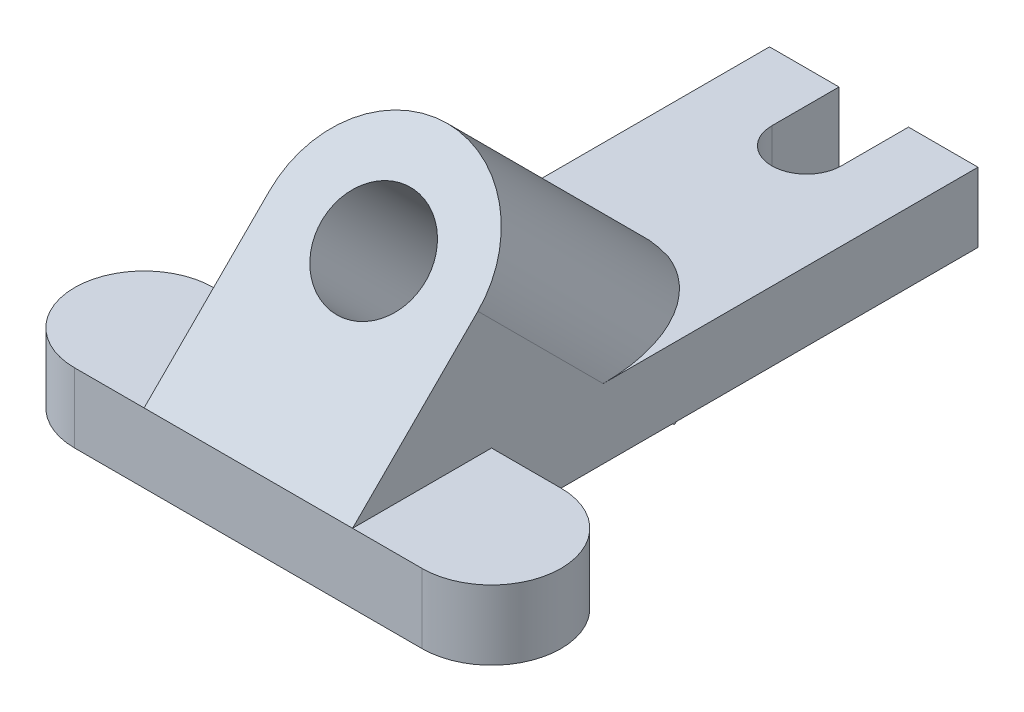
ISO-10303-21;
HEADER;
FILE_DESCRIPTION(('STEP AP214'),'2;1');
FILE_NAME('part.step','',(''),(''),'','','');
FILE_SCHEMA(('AUTOMOTIVE_DESIGN { 1 0 10303 214 1 1 1 1 }'));
ENDSEC;
DATA;
#1=APPLICATION_CONTEXT('core data for automotive mechanical design processes');
#2=APPLICATION_PROTOCOL_DEFINITION('international standard','automotive_design',2000,#1);
#3=PRODUCT_CONTEXT('',#1,'mechanical');
#4=PRODUCT('Part','Part','',(#3));
#5=PRODUCT_RELATED_PRODUCT_CATEGORY('part','',(#4));
#6=PRODUCT_DEFINITION_FORMATION('','',#4);
#7=PRODUCT_DEFINITION_CONTEXT('part definition',#1,'design');
#8=PRODUCT_DEFINITION('design','',#6,#7);
#9=PRODUCT_DEFINITION_SHAPE('','',#8);
#10=(LENGTH_UNIT() NAMED_UNIT(*) SI_UNIT(.MILLI.,.METRE.));
#11=(NAMED_UNIT(*) PLANE_ANGLE_UNIT() SI_UNIT($,.RADIAN.));
#12=(NAMED_UNIT(*) SI_UNIT($,.STERADIAN.) SOLID_ANGLE_UNIT());
#13=UNCERTAINTY_MEASURE_WITH_UNIT(LENGTH_MEASURE(1.E-05),#10,'distance_accuracy_value','');
#14=(GEOMETRIC_REPRESENTATION_CONTEXT(3) GLOBAL_UNCERTAINTY_ASSIGNED_CONTEXT((#13)) GLOBAL_UNIT_ASSIGNED_CONTEXT((#10,
#11,#12)) REPRESENTATION_CONTEXT('',''));
#15=CARTESIAN_POINT('',(0.,0.,0.));
#16=DIRECTION('',(0.,0.,1.));
#17=DIRECTION('',(1.,0.,0.));
#18=AXIS2_PLACEMENT_3D('',#15,#16,#17);
#19=CARTESIAN_POINT('',(-60.,29.4418604651163,-70.3255813953488));
#20=DIRECTION('',(0.,0.,-1.));
#21=DIRECTION('',(-1.,0.,0.));
#22=AXIS2_PLACEMENT_3D('',#19,#20,#21);
#23=PLANE('',#22);
#24=DIRECTION('',(0.,1.,0.));
#25=VECTOR('',#24,1.);
#26=CARTESIAN_POINT('',(-20.,9.44186046511627,-70.3255813953488));
#27=LINE('',#26,#25);
#28=CARTESIAN_POINT('',(-20.,9.44186046511627,-70.3255813953488));
#29=VERTEX_POINT('',#28);
#30=CARTESIAN_POINT('',(-20.,29.4418604651163,-70.3255813953488));
#31=VERTEX_POINT('',#30);
#32=EDGE_CURVE('E220',#29,#31,#27,.T.);
#33=ORIENTED_EDGE('',*,*,#32,.T.);
#34=DIRECTION('',(1.,0.,0.));
#35=VECTOR('',#34,1.);
#36=CARTESIAN_POINT('',(-60.,29.4418604651163,-70.3255813953488));
#37=LINE('',#36,#35);
#38=CARTESIAN_POINT('',(0.,29.4418604651163,-70.3255813953488));
#39=VERTEX_POINT('',#38);
#40=EDGE_CURVE('E355',#31,#39,#37,.T.);
#41=ORIENTED_EDGE('',*,*,#40,.T.);
#42=DIRECTION('',(0.,1.,0.));
#43=VECTOR('',#42,1.);
#44=CARTESIAN_POINT('',(0.,29.4418604651163,-70.3255813953488));
#45=LINE('',#44,#43);
#46=CARTESIAN_POINT('',(0.,9.44186046511627,-70.3255813953488));
#47=VERTEX_POINT('',#46);
#48=EDGE_CURVE('E340',#47,#39,#45,.T.);
#49=ORIENTED_EDGE('',*,*,#48,.F.);
#50=DIRECTION('',(1.,0.,0.));
#51=VECTOR('',#50,1.);
#52=CARTESIAN_POINT('',(-60.,9.44186046511627,-70.3255813953488));
#53=LINE('',#52,#51);
#54=EDGE_CURVE('E337',#29,#47,#53,.T.);
#55=ORIENTED_EDGE('',*,*,#54,.F.);
#56=EDGE_LOOP('',(#33,#41,#49,#55));
#57=FACE_BOUND('',#56,.T.);
#58=ADVANCED_FACE('F41',(#57),#23,.T.);
#59=CARTESIAN_POINT('',(0.,8.93576381070593,17.0434302692135));
#60=DIRECTION('',(0.,0.707106781186544,-0.707106781186551));
#61=DIRECTION('',(0.,0.707106781186551,0.707106781186544));
#62=AXIS2_PLACEMENT_3D('',#59,#60,#61);
#63=PLANE('',#62);
#64=DIRECTION('',(-1.,0.,0.));
#65=VECTOR('',#64,1.);
#66=CARTESIAN_POINT('',(0.,8.93576381070593,17.0434302692135));
#67=LINE('',#66,#65);
#68=CARTESIAN_POINT('',(-45.,8.93576381070593,17.0434302692135));
#69=VERTEX_POINT('',#68);
#70=CARTESIAN_POINT('',(-60.,8.93576381070592,17.0434302692136));
#71=VERTEX_POINT('',#70);
#72=EDGE_CURVE('E288',#69,#71,#67,.T.);
#73=ORIENTED_EDGE('',*,*,#72,.F.);
#74=DIRECTION('',(0.,0.707106781186551,0.707106781186544));
#75=VECTOR('',#74,1.);
#76=CARTESIAN_POINT('',(-45.,8.93576381070593,17.0434302692135));
#77=LINE('',#76,#75);
#78=CARTESIAN_POINT('',(-45.,9.44186046511626,17.5495269236239));
#79=VERTEX_POINT('',#78);
#80=EDGE_CURVE('E280',#69,#79,#77,.T.);
#81=ORIENTED_EDGE('',*,*,#80,.T.);
#82=DIRECTION('',(1.,0.,0.));
#83=VECTOR('',#82,1.);
#84=CARTESIAN_POINT('',(-60.,9.44186046511626,17.5495269236239));
#85=LINE('',#84,#83);
#86=CARTESIAN_POINT('',(-60.,9.44186046511626,17.5495269236239));
#87=VERTEX_POINT('',#86);
#88=EDGE_CURVE('E309',#87,#79,#85,.T.);
#89=ORIENTED_EDGE('',*,*,#88,.F.);
#90=DIRECTION('',(0.,0.707106781186551,0.707106781186544));
#91=VECTOR('',#90,1.);
#92=CARTESIAN_POINT('',(-60.,8.93576381070592,17.0434302692136));
#93=LINE('',#92,#91);
#94=EDGE_CURVE('E296',#71,#87,#93,.T.);
#95=ORIENTED_EDGE('',*,*,#94,.F.);
#96=EDGE_LOOP('',(#73,#81,#89,#95));
#97=FACE_BOUND('',#96,.T.);
#98=ADVANCED_FACE('F374',(#97),#63,.F.);
#99=CARTESIAN_POINT('',(0.,12.9895970399598,12.9895970399597));
#100=DIRECTION('',(0.,0.707106781186551,0.707106781186544));
#101=DIRECTION('',(0.,-0.707106781186544,0.707106781186551));
#102=AXIS2_PLACEMENT_3D('',#99,#100,#101);
#103=PLANE('',#102);
#104=CARTESIAN_POINT('',(0.,8.93576381070593,17.0434302692135));
#105=VERTEX_POINT('',#104);
#106=CARTESIAN_POINT('',(-15.,8.93576381070593,17.0434302692135));
#107=VERTEX_POINT('',#106);
#108=EDGE_CURVE('E284',#105,#107,#67,.T.);
#109=ORIENTED_EDGE('',*,*,#108,.T.);
#110=CARTESIAN_POINT('',(-30.,8.93576381070592,17.0434302692135));
#111=DIRECTION('',(0.,0.707106781186551,0.707106781186544));
#112=DIRECTION('',(0.,-0.707106781186544,0.707106781186551));
#113=AXIS2_PLACEMENT_3D('',#110,#111,#112);
#114=CIRCLE('',#113,15.);
#115=CARTESIAN_POINT('',(-15.0170853185106,9.44186046511625,16.5373336148032));
#116=VERTEX_POINT('',#115);
#117=EDGE_CURVE('E269',#107,#116,#114,.T.);
#118=ORIENTED_EDGE('',*,*,#117,.T.);
#119=DIRECTION('',(-1.,0.,0.));
#120=VECTOR('',#119,1.);
#121=CARTESIAN_POINT('',(-60.,9.44186046511626,16.5373336148032));
#122=LINE('',#121,#120);
#123=CARTESIAN_POINT('',(-0.00853900936485796,9.44186046511627,16.5373336148032));
#124=VERTEX_POINT('',#123);
#125=EDGE_CURVE('E49',#124,#116,#122,.T.);
#126=ORIENTED_EDGE('',*,*,#125,.F.);
#127=CARTESIAN_POINT('',(-30.,8.93576381070593,17.0434302692136));
#128=DIRECTION('',(0.,0.707106781186551,0.707106781186544));
#129=DIRECTION('',(0.,-0.707106781186544,0.707106781186551));
#130=AXIS2_PLACEMENT_3D('',#127,#128,#129);
#131=CIRCLE('',#130,30.);
#132=EDGE_CURVE('E289',#105,#124,#131,.T.);
#133=ORIENTED_EDGE('',*,*,#132,.F.);
#134=EDGE_LOOP('',(#109,#118,#126,#133));
#135=FACE_BOUND('',#134,.T.);
#136=ADVANCED_FACE('F415',(#135),#103,.F.);
#137=CARTESIAN_POINT('',(-60.,9.44186046511627,-70.3255813953488));
#138=DIRECTION('',(0.,-1.,0.));
#139=DIRECTION('',(0.,0.,-1.));
#140=AXIS2_PLACEMENT_3D('',#137,#138,#139);
#141=PLANE('',#140);
#142=CARTESIAN_POINT('',(-30.,9.44186046511626,17.5495269236239));
#143=DIRECTION('',(0.,-1.,0.));
#144=DIRECTION('',(0.,0.,1.));
#145=AXIS2_PLACEMENT_3D('',#142,#143,#144);
#146=ELLIPSE('',#145,21.2132034355963,15.);
#147=CARTESIAN_POINT('',(-15.,9.44186046511627,17.5495269236239));
#148=VERTEX_POINT('',#147);
#149=EDGE_CURVE('E278',#148,#79,#146,.T.);
#150=ORIENTED_EDGE('',*,*,#149,.F.);
#151=CARTESIAN_POINT('',(0.,9.44186046511627,17.5495269236239));
#152=VERTEX_POINT('',#151);
#153=EDGE_CURVE('E313',#148,#152,#85,.T.);
#154=ORIENTED_EDGE('',*,*,#153,.T.);
#155=DIRECTION('',(0.,0.,-1.));
#156=VECTOR('',#155,1.);
#157=CARTESIAN_POINT('',(0.,9.44186046511627,-70.3255813953488));
#158=LINE('',#157,#156);
#159=CARTESIAN_POINT('',(0.,9.44186046511627,69.6744186046512));
#160=VERTEX_POINT('',#159);
#161=EDGE_CURVE('E338',#160,#152,#158,.T.);
#162=ORIENTED_EDGE('',*,*,#161,.F.);
#163=DIRECTION('',(-1.,0.,0.));
#164=VECTOR('',#163,1.);
#165=CARTESIAN_POINT('',(20.,9.44186046511627,69.6744186046512));
#166=LINE('',#165,#164);
#167=CARTESIAN_POINT('',(20.,9.44186046511627,69.6744186046512));
#168=VERTEX_POINT('',#167);
#169=EDGE_CURVE('E253',#168,#160,#166,.T.);
#170=ORIENTED_EDGE('',*,*,#169,.F.);
#171=CARTESIAN_POINT('',(20.,9.44186046511627,89.6744186046511));
#172=DIRECTION('',(0.,1.,0.));
#173=DIRECTION('',(0.,0.,1.));
#174=AXIS2_PLACEMENT_3D('',#171,#172,#173);
#175=CIRCLE('',#174,20.);
#176=CARTESIAN_POINT('',(20.,9.44186046511627,109.674418604651));
#177=VERTEX_POINT('',#176);
#178=EDGE_CURVE('E250',#177,#168,#175,.T.);
#179=ORIENTED_EDGE('',*,*,#178,.F.);
#180=DIRECTION('',(1.,0.,0.));
#181=VECTOR('',#180,1.);
#182=CARTESIAN_POINT('',(-60.,9.44186046511625,109.674418604651));
#183=LINE('',#182,#181);
#184=CARTESIAN_POINT('',(-80.,9.44186046511627,109.674418604651));
#185=VERTEX_POINT('',#184);
#186=EDGE_CURVE('E346',#185,#177,#183,.T.);
#187=ORIENTED_EDGE('',*,*,#186,.F.);
#188=CARTESIAN_POINT('',(-80.,9.44186046511627,89.6744186046511));
#189=DIRECTION('',(0.,1.,0.));
#190=DIRECTION('',(0.,0.,-1.));
#191=AXIS2_PLACEMENT_3D('',#188,#189,#190);
#192=CIRCLE('',#191,20.);
#193=CARTESIAN_POINT('',(-80.,9.44186046511627,69.6744186046511));
#194=VERTEX_POINT('',#193);
#195=EDGE_CURVE('E229',#194,#185,#192,.T.);
#196=ORIENTED_EDGE('',*,*,#195,.F.);
#197=DIRECTION('',(-1.,0.,0.));
#198=VECTOR('',#197,1.);
#199=CARTESIAN_POINT('',(-80.,9.44186046511627,69.6744186046511));
#200=LINE('',#199,#198);
#201=CARTESIAN_POINT('',(-60.,9.44186046511627,69.6744186046512));
#202=VERTEX_POINT('',#201);
#203=EDGE_CURVE('E236',#202,#194,#200,.T.);
#204=ORIENTED_EDGE('',*,*,#203,.F.);
#205=DIRECTION('',(0.,0.,-1.));
#206=VECTOR('',#205,1.);
#207=CARTESIAN_POINT('',(-60.,9.44186046511627,-70.3255813953488));
#208=LINE('',#207,#206);
#209=EDGE_CURVE('E328',#202,#87,#208,.T.);
#210=ORIENTED_EDGE('',*,*,#209,.T.);
#211=ORIENTED_EDGE('',*,*,#88,.T.);
#212=EDGE_LOOP('',(#150,#154,#162,#170,#179,#187,#196,#204,#210,#211));
#213=FACE_BOUND('',#212,.T.);
#214=ADVANCED_FACE('F377',(#213),#141,.T.);
#215=CARTESIAN_POINT('',(-60.,29.4418604651163,109.674418604651));
#216=DIRECTION('',(0.,1.,0.));
#217=DIRECTION('',(0.,0.,1.));
#218=AXIS2_PLACEMENT_3D('',#215,#216,#217);
#219=PLANE('',#218);
#220=DIRECTION('',(0.,0.,-1.));
#221=VECTOR('',#220,1.);
#222=CARTESIAN_POINT('',(-20.,29.4418604651163,-70.3255813953488));
#223=LINE('',#222,#221);
#224=CARTESIAN_POINT('',(-20.,29.4418604651163,-50.9883389137586));
#225=VERTEX_POINT('',#224);
#226=EDGE_CURVE('E212',#225,#31,#223,.T.);
#227=ORIENTED_EDGE('',*,*,#226,.F.);
#228=CARTESIAN_POINT('',(-30.,29.4418604651163,-50.9883389137586));
#229=DIRECTION('',(0.,1.,0.));
#230=DIRECTION('',(0.,0.,1.));
#231=AXIS2_PLACEMENT_3D('',#228,#229,#230);
#232=CIRCLE('',#231,10.);
#233=CARTESIAN_POINT('',(-40.,29.4418604651163,-50.9883389137586));
#234=VERTEX_POINT('',#233);
#235=EDGE_CURVE('E214',#234,#225,#232,.T.);
#236=ORIENTED_EDGE('',*,*,#235,.F.);
#237=DIRECTION('',(0.,0.,1.));
#238=VECTOR('',#237,1.);
#239=CARTESIAN_POINT('',(-40.,29.4418604651163,-70.3255813953488));
#240=LINE('',#239,#238);
#241=CARTESIAN_POINT('',(-40.,29.4418604651163,-70.3255813953488));
#242=VERTEX_POINT('',#241);
#243=EDGE_CURVE('E194',#242,#234,#240,.T.);
#244=ORIENTED_EDGE('',*,*,#243,.F.);
#245=CARTESIAN_POINT('',(-60.,29.4418604651163,-70.3255813953488));
#246=VERTEX_POINT('',#245);
#247=EDGE_CURVE('E352',#246,#242,#37,.T.);
#248=ORIENTED_EDGE('',*,*,#247,.F.);
#249=DIRECTION('',(0.,0.,1.));
#250=VECTOR('',#249,1.);
#251=CARTESIAN_POINT('',(-60.,29.4418604651163,109.674418604651));
#252=LINE('',#251,#250);
#253=CARTESIAN_POINT('',(-60.,29.4418604651163,37.5495269236237));
#254=VERTEX_POINT('',#253);
#255=EDGE_CURVE('E334',#246,#254,#252,.T.);
#256=ORIENTED_EDGE('',*,*,#255,.T.);
#257=CARTESIAN_POINT('',(-30.,29.4418604651163,37.5495269236237));
#258=DIRECTION('',(0.,1.,0.));
#259=DIRECTION('',(0.,0.,1.));
#260=AXIS2_PLACEMENT_3D('',#257,#258,#259);
#261=ELLIPSE('',#260,42.4264068711926,30.);
#262=CARTESIAN_POINT('',(-37.6811457478655,29.4418604651163,-3.46266638519702));
#263=VERTEX_POINT('',#262);
#264=EDGE_CURVE('E305',#263,#254,#261,.T.);
#265=ORIENTED_EDGE('',*,*,#264,.F.);
#266=DIRECTION('',(1.,0.,0.));
#267=VECTOR('',#266,1.);
#268=CARTESIAN_POINT('',(-60.,29.4418604651163,-3.46266638519703));
#269=LINE('',#268,#267);
#270=CARTESIAN_POINT('',(-22.3188542521345,29.4418604651163,-3.46266638519702));
#271=VERTEX_POINT('',#270);
#272=EDGE_CURVE('E312',#263,#271,#269,.T.);
#273=ORIENTED_EDGE('',*,*,#272,.T.);
#274=CARTESIAN_POINT('',(0.,29.4418604651163,37.5495269236237));
#275=VERTEX_POINT('',#274);
#276=EDGE_CURVE('E308',#275,#271,#261,.T.);
#277=ORIENTED_EDGE('',*,*,#276,.F.);
#278=DIRECTION('',(0.,0.,1.));
#279=VECTOR('',#278,1.);
#280=CARTESIAN_POINT('',(0.,29.4418604651163,109.674418604651));
#281=LINE('',#280,#279);
#282=EDGE_CURVE('E343',#39,#275,#281,.T.);
#283=ORIENTED_EDGE('',*,*,#282,.F.);
#284=ORIENTED_EDGE('',*,*,#40,.F.);
#285=EDGE_LOOP('',(#227,#236,#244,#248,#256,#265,#273,#277,#283,#284));
#286=FACE_BOUND('',#285,.T.);
#287=ADVANCED_FACE('F392',(#286),#219,.T.);
#288=DIRECTION('',(0.,0.,-1.));
#289=VECTOR('',#288,1.);
#290=CARTESIAN_POINT('',(-20.,9.44186046511627,-70.3255813953488));
#291=LINE('',#290,#289);
#292=CARTESIAN_POINT('',(-20.,9.44186046511627,-50.9883389137586));
#293=VERTEX_POINT('',#292);
#294=EDGE_CURVE('E207',#293,#29,#291,.T.);
#295=ORIENTED_EDGE('',*,*,#294,.T.);
#296=ORIENTED_EDGE('',*,*,#54,.T.);
#297=EDGE_CURVE('E323',#152,#47,#158,.T.);
#298=ORIENTED_EDGE('',*,*,#297,.F.);
#299=CARTESIAN_POINT('',(-30.,9.44186046511626,17.5495269236239));
#300=DIRECTION('',(0.,-1.,0.));
#301=DIRECTION('',(0.,0.,1.));
#302=AXIS2_PLACEMENT_3D('',#299,#300,#301);
#303=ELLIPSE('',#302,42.4264068711926,30.);
#304=EDGE_CURVE('E299',#124,#152,#303,.T.);
#305=ORIENTED_EDGE('',*,*,#304,.F.);
#306=ORIENTED_EDGE('',*,*,#125,.T.);
#307=CARTESIAN_POINT('',(-44.9829146814894,9.44186046511626,16.5373336148032));
#308=VERTEX_POINT('',#307);
#309=EDGE_CURVE('E357',#116,#308,#122,.T.);
#310=ORIENTED_EDGE('',*,*,#309,.T.);
#311=CARTESIAN_POINT('',(-59.9914609906351,9.44186046511627,16.5373336148032));
#312=VERTEX_POINT('',#311);
#313=EDGE_CURVE('E348',#308,#312,#122,.T.);
#314=ORIENTED_EDGE('',*,*,#313,.T.);
#315=EDGE_CURVE('E304',#87,#312,#303,.T.);
#316=ORIENTED_EDGE('',*,*,#315,.F.);
#317=CARTESIAN_POINT('',(-60.,9.44186046511627,-70.3255813953488));
#318=VERTEX_POINT('',#317);
#319=EDGE_CURVE('E331',#87,#318,#208,.T.);
#320=ORIENTED_EDGE('',*,*,#319,.T.);
#321=CARTESIAN_POINT('',(-40.,9.44186046511627,-70.3255813953488));
#322=VERTEX_POINT('',#321);
#323=EDGE_CURVE('E211',#318,#322,#53,.T.);
#324=ORIENTED_EDGE('',*,*,#323,.T.);
#325=DIRECTION('',(0.,0.,1.));
#326=VECTOR('',#325,1.);
#327=CARTESIAN_POINT('',(-40.,9.44186046511627,-70.3255813953488));
#328=LINE('',#327,#326);
#329=CARTESIAN_POINT('',(-40.,9.44186046511627,-50.9883389137586));
#330=VERTEX_POINT('',#329);
#331=EDGE_CURVE('E56',#322,#330,#328,.T.);
#332=ORIENTED_EDGE('',*,*,#331,.T.);
#333=CARTESIAN_POINT('',(-30.,9.44186046511627,-50.9883389137586));
#334=DIRECTION('',(0.,1.,0.));
#335=DIRECTION('',(0.,0.,1.));
#336=AXIS2_PLACEMENT_3D('',#333,#334,#335);
#337=CIRCLE('',#336,10.);
#338=EDGE_CURVE('E202',#330,#293,#337,.T.);
#339=ORIENTED_EDGE('',*,*,#338,.T.);
#340=EDGE_LOOP('',(#295,#296,#298,#305,#306,#310,#314,#316,#320,#324,#332,#339));
#341=FACE_BOUND('',#340,.T.);
#342=ADVANCED_FACE('F43',(#341),#141,.T.);
#343=CARTESIAN_POINT('',(-60.,9.44186046511625,109.674418604651));
#344=DIRECTION('',(0.,0.,1.));
#345=DIRECTION('',(1.,0.,0.));
#346=AXIS2_PLACEMENT_3D('',#343,#344,#345);
#347=PLANE('',#346);
#348=ORIENTED_EDGE('',*,*,#186,.T.);
#349=DIRECTION('',(0.,1.,0.));
#350=VECTOR('',#349,1.);
#351=CARTESIAN_POINT('',(20.,9.44186046511627,109.674418604651));
#352=LINE('',#351,#350);
#353=CARTESIAN_POINT('',(20.,29.4418604651163,109.674418604651));
#354=VERTEX_POINT('',#353);
#355=EDGE_CURVE('E255',#177,#354,#352,.T.);
#356=ORIENTED_EDGE('',*,*,#355,.T.);
#357=DIRECTION('',(1.,0.,0.));
#358=VECTOR('',#357,1.);
#359=CARTESIAN_POINT('',(0.,29.4418604651163,109.674418604651));
#360=LINE('',#359,#358);
#361=CARTESIAN_POINT('',(0.,29.4418604651163,109.674418604651));
#362=VERTEX_POINT('',#361);
#363=EDGE_CURVE('E257',#362,#354,#360,.T.);
#364=ORIENTED_EDGE('',*,*,#363,.F.);
#365=DIRECTION('',(1.,0.,0.));
#366=VECTOR('',#365,1.);
#367=CARTESIAN_POINT('',(-60.,29.4418604651163,109.674418604651));
#368=LINE('',#367,#366);
#369=CARTESIAN_POINT('',(-60.,29.4418604651163,109.674418604651));
#370=VERTEX_POINT('',#369);
#371=EDGE_CURVE('E349',#370,#362,#368,.T.);
#372=ORIENTED_EDGE('',*,*,#371,.F.);
#373=DIRECTION('',(1.,0.,0.));
#374=VECTOR('',#373,1.);
#375=CARTESIAN_POINT('',(-60.,29.4418604651163,109.674418604651));
#376=LINE('',#375,#374);
#377=CARTESIAN_POINT('',(-80.,29.4418604651163,109.674418604651));
#378=VERTEX_POINT('',#377);
#379=EDGE_CURVE('E233',#378,#370,#376,.T.);
#380=ORIENTED_EDGE('',*,*,#379,.F.);
#381=DIRECTION('',(0.,1.,0.));
#382=VECTOR('',#381,1.);
#383=CARTESIAN_POINT('',(-80.,9.44186046511627,109.674418604651));
#384=LINE('',#383,#382);
#385=EDGE_CURVE('E223',#185,#378,#384,.T.);
#386=ORIENTED_EDGE('',*,*,#385,.F.);
#387=EDGE_LOOP('',(#348,#356,#364,#372,#380,#386));
#388=FACE_BOUND('',#387,.T.);
#389=ADVANCED_FACE('F441',(#388),#347,.T.);
#390=DIRECTION('',(0.,1.,0.));
#391=VECTOR('',#390,1.);
#392=CARTESIAN_POINT('',(-40.,9.44186046511627,-70.3255813953488));
#393=LINE('',#392,#391);
#394=EDGE_CURVE('E199',#322,#242,#393,.T.);
#395=ORIENTED_EDGE('',*,*,#394,.F.);
#396=ORIENTED_EDGE('',*,*,#323,.F.);
#397=DIRECTION('',(0.,1.,0.));
#398=VECTOR('',#397,1.);
#399=CARTESIAN_POINT('',(-60.,29.4418604651163,-70.3255813953488));
#400=LINE('',#399,#398);
#401=EDGE_CURVE('E330',#318,#246,#400,.T.);
#402=ORIENTED_EDGE('',*,*,#401,.T.);
#403=ORIENTED_EDGE('',*,*,#247,.T.);
#404=EDGE_LOOP('',(#395,#396,#402,#403));
#405=FACE_BOUND('',#404,.T.);
#406=ADVANCED_FACE('F389',(#405),#23,.T.);
#407=CARTESIAN_POINT('',(-60.,0.,0.));
#408=DIRECTION('',(-1.,0.,0.));
#409=DIRECTION('',(0.,0.,1.));
#410=AXIS2_PLACEMENT_3D('',#407,#408,#409);
#411=PLANE('',#410);
#412=DIRECTION('',(0.,1.,0.));
#413=VECTOR('',#412,1.);
#414=CARTESIAN_POINT('',(-60.,9.44186046511627,69.6744186046512));
#415=LINE('',#414,#413);
#416=CARTESIAN_POINT('',(-60.,29.4418604651163,69.6744186046512));
#417=VERTEX_POINT('',#416);
#418=EDGE_CURVE('E226',#202,#417,#415,.T.);
#419=ORIENTED_EDGE('',*,*,#418,.T.);
#420=DIRECTION('',(0.,0.,-1.));
#421=VECTOR('',#420,1.);
#422=CARTESIAN_POINT('',(-60.,29.4418604651163,109.674418604651));
#423=LINE('',#422,#421);
#424=EDGE_CURVE('E242',#370,#417,#423,.T.);
#425=ORIENTED_EDGE('',*,*,#424,.F.);
#426=DIRECTION('',(0.,-0.707106781186544,0.707106781186551));
#427=VECTOR('',#426,1.);
#428=CARTESIAN_POINT('',(-60.,29.4418604651163,109.674418604651));
#429=LINE('',#428,#427);
#430=CARTESIAN_POINT('',(-60.,65.50430630563,73.611972764137));
#431=VERTEX_POINT('',#430);
#432=EDGE_CURVE('E319',#431,#370,#429,.T.);
#433=ORIENTED_EDGE('',*,*,#432,.F.);
#434=DIRECTION('',(0.,0.707106781186551,0.707106781186544));
#435=VECTOR('',#434,1.);
#436=CARTESIAN_POINT('',(-60.,65.50430630563,73.611972764137));
#437=LINE('',#436,#435);
#438=EDGE_CURVE('E316',#254,#431,#437,.T.);
#439=ORIENTED_EDGE('',*,*,#438,.F.);
#440=ORIENTED_EDGE('',*,*,#255,.F.);
#441=ORIENTED_EDGE('',*,*,#401,.F.);
#442=ORIENTED_EDGE('',*,*,#319,.F.);
#443=ORIENTED_EDGE('',*,*,#209,.F.);
#444=EDGE_LOOP('',(#419,#425,#433,#439,#440,#441,#442,#443));
#445=FACE_BOUND('',#444,.T.);
#446=ADVANCED_FACE('F384',(#445),#411,.T.);
#447=CARTESIAN_POINT('',(0.,0.,0.));
#448=DIRECTION('',(-1.,0.,0.));
#449=DIRECTION('',(0.,0.,1.));
#450=AXIS2_PLACEMENT_3D('',#447,#448,#449);
#451=PLANE('',#450);
#452=DIRECTION('',(0.,0.,1.));
#453=VECTOR('',#452,1.);
#454=CARTESIAN_POINT('',(0.,29.4418604651163,69.6744186046512));
#455=LINE('',#454,#453);
#456=CARTESIAN_POINT('',(0.,29.4418604651163,69.6744186046512));
#457=VERTEX_POINT('',#456);
#458=EDGE_CURVE('E245',#457,#362,#455,.T.);
#459=ORIENTED_EDGE('',*,*,#458,.F.);
#460=DIRECTION('',(0.,1.,0.));
#461=VECTOR('',#460,1.);
#462=CARTESIAN_POINT('',(0.,9.44186046511627,69.6744186046512));
#463=LINE('',#462,#461);
#464=EDGE_CURVE('E263',#160,#457,#463,.T.);
#465=ORIENTED_EDGE('',*,*,#464,.F.);
#466=ORIENTED_EDGE('',*,*,#161,.T.);
#467=ORIENTED_EDGE('',*,*,#297,.T.);
#468=ORIENTED_EDGE('',*,*,#48,.T.);
#469=ORIENTED_EDGE('',*,*,#282,.T.);
#470=DIRECTION('',(0.,0.707106781186551,0.707106781186544));
#471=VECTOR('',#470,1.);
#472=CARTESIAN_POINT('',(0.,65.50430630563,73.611972764137));
#473=LINE('',#472,#471);
#474=CARTESIAN_POINT('',(0.,65.50430630563,73.611972764137));
#475=VERTEX_POINT('',#474);
#476=EDGE_CURVE('E315',#275,#475,#473,.T.);
#477=ORIENTED_EDGE('',*,*,#476,.T.);
#478=DIRECTION('',(0.,-0.707106781186544,0.707106781186551));
#479=VECTOR('',#478,1.);
#480=CARTESIAN_POINT('',(0.,29.4418604651163,109.674418604651));
#481=LINE('',#480,#479);
#482=EDGE_CURVE('E320',#475,#362,#481,.T.);
#483=ORIENTED_EDGE('',*,*,#482,.T.);
#484=EDGE_LOOP('',(#459,#465,#466,#467,#468,#469,#477,#483));
#485=FACE_BOUND('',#484,.T.);
#486=ADVANCED_FACE('F404',(#485),#451,.F.);
#487=CARTESIAN_POINT('',(-60.,29.4418604651163,109.674418604651));
#488=DIRECTION('',(0.,0.707106781186551,0.707106781186544));
#489=DIRECTION('',(0.,-0.707106781186544,0.707106781186551));
#490=AXIS2_PLACEMENT_3D('',#487,#488,#489);
#491=PLANE('',#490);
#492=CARTESIAN_POINT('',(-30.,65.50430630563,73.611972764137));
#493=DIRECTION('',(0.,0.707106781186551,0.707106781186544));
#494=DIRECTION('',(0.,-0.707106781186544,0.707106781186551));
#495=AXIS2_PLACEMENT_3D('',#492,#493,#494);
#496=CIRCLE('',#495,15.);
#497=CARTESIAN_POINT('',(-30.,54.8977045878319,84.2185744819353));
#498=VERTEX_POINT('',#497);
#499=EDGE_CURVE('E265',#498,#498,#496,.T.);
#500=ORIENTED_EDGE('',*,*,#499,.F.);
#501=EDGE_LOOP('',(#500));
#502=FACE_BOUND('',#501,.T.);
#503=ORIENTED_EDGE('',*,*,#482,.F.);
#504=CARTESIAN_POINT('',(-30.,65.50430630563,73.6119727641371));
#505=DIRECTION('',(0.,0.707106781186551,0.707106781186544));
#506=DIRECTION('',(0.,-0.707106781186544,0.707106781186551));
#507=AXIS2_PLACEMENT_3D('',#504,#505,#506);
#508=CIRCLE('',#507,30.);
#509=EDGE_CURVE('E283',#475,#431,#508,.T.);
#510=ORIENTED_EDGE('',*,*,#509,.T.);
#511=ORIENTED_EDGE('',*,*,#432,.T.);
#512=ORIENTED_EDGE('',*,*,#371,.T.);
#513=EDGE_LOOP('',(#503,#510,#511,#512));
#514=FACE_BOUND('',#513,.T.);
#515=ADVANCED_FACE('F470',(#502,#514),#491,.T.);
#516=CARTESIAN_POINT('',(-30.,8.93576381070593,17.0434302692136));
#517=DIRECTION('',(0.,0.707106781186551,0.707106781186544));
#518=DIRECTION('',(0.,-0.707106781186544,0.707106781186551));
#519=AXIS2_PLACEMENT_3D('',#516,#517,#518);
#520=CYLINDRICAL_SURFACE('',#519,30.);
#521=ORIENTED_EDGE('',*,*,#476,.F.);
#522=ORIENTED_EDGE('',*,*,#276,.T.);
#523=EDGE_CURVE('E293',#271,#263,#131,.T.);
#524=ORIENTED_EDGE('',*,*,#523,.T.);
#525=ORIENTED_EDGE('',*,*,#264,.T.);
#526=ORIENTED_EDGE('',*,*,#438,.T.);
#527=ORIENTED_EDGE('',*,*,#509,.F.);
#528=EDGE_LOOP('',(#521,#522,#524,#525,#526,#527));
#529=FACE_BOUND('',#528,.T.);
#530=ADVANCED_FACE('F464',(#529),#520,.T.);
#531=ORIENTED_EDGE('',*,*,#272,.F.);
#532=ORIENTED_EDGE('',*,*,#523,.F.);
#533=EDGE_LOOP('',(#531,#532));
#534=FACE_BOUND('',#533,.T.);
#535=ADVANCED_FACE('F432',(#534),#103,.F.);
#536=ORIENTED_EDGE('',*,*,#94,.T.);
#537=ORIENTED_EDGE('',*,*,#315,.T.);
#538=EDGE_CURVE('E287',#312,#71,#131,.T.);
#539=ORIENTED_EDGE('',*,*,#538,.T.);
#540=EDGE_LOOP('',(#536,#537,#539));
#541=FACE_BOUND('',#540,.T.);
#542=ADVANCED_FACE('F371',(#541),#520,.T.);
#543=ORIENTED_EDGE('',*,*,#153,.F.);
#544=DIRECTION('',(0.,0.707106781186551,0.707106781186544));
#545=VECTOR('',#544,1.);
#546=CARTESIAN_POINT('',(-15.,8.93576381070593,17.0434302692135));
#547=LINE('',#546,#545);
#548=EDGE_CURVE('E272',#148,#107,#547,.F.);
#549=ORIENTED_EDGE('',*,*,#548,.T.);
#550=ORIENTED_EDGE('',*,*,#108,.F.);
#551=DIRECTION('',(0.,0.707106781186551,0.707106781186544));
#552=VECTOR('',#551,1.);
#553=CARTESIAN_POINT('',(0.,8.93576381070593,17.0434302692135));
#554=LINE('',#553,#552);
#555=EDGE_CURVE('E292',#105,#152,#554,.T.);
#556=ORIENTED_EDGE('',*,*,#555,.T.);
#557=EDGE_LOOP('',(#543,#549,#550,#556));
#558=FACE_BOUND('',#557,.T.);
#559=ADVANCED_FACE('F413',(#558),#63,.F.);
#560=ORIENTED_EDGE('',*,*,#132,.T.);
#561=ORIENTED_EDGE('',*,*,#304,.T.);
#562=ORIENTED_EDGE('',*,*,#555,.F.);
#563=EDGE_LOOP('',(#560,#561,#562));
#564=FACE_BOUND('',#563,.T.);
#565=ADVANCED_FACE('F410',(#564),#520,.T.);
#566=ORIENTED_EDGE('',*,*,#313,.F.);
#567=CARTESIAN_POINT('',(-30.,8.93576381070592,17.0434302692135));
#568=DIRECTION('',(0.,0.707106781186551,0.707106781186544));
#569=DIRECTION('',(0.,-0.707106781186544,0.707106781186551));
#570=AXIS2_PLACEMENT_3D('',#567,#568,#569);
#571=CIRCLE('',#570,15.);
#572=EDGE_CURVE('E11',#308,#69,#571,.T.);
#573=ORIENTED_EDGE('',*,*,#572,.T.);
#574=ORIENTED_EDGE('',*,*,#72,.T.);
#575=ORIENTED_EDGE('',*,*,#538,.F.);
#576=EDGE_LOOP('',(#566,#573,#574,#575));
#577=FACE_BOUND('',#576,.T.);
#578=ADVANCED_FACE('F367',(#577),#103,.F.);
#579=CARTESIAN_POINT('',(-30.,8.93576381070592,17.0434302692135));
#580=DIRECTION('',(0.,0.707106781186551,0.707106781186544));
#581=DIRECTION('',(0.,-0.707106781186544,0.707106781186551));
#582=AXIS2_PLACEMENT_3D('',#579,#580,#581);
#583=PLANE('',#582);
#584=EDGE_CURVE('E273',#116,#308,#114,.T.);
#585=ORIENTED_EDGE('',*,*,#584,.T.);
#586=ORIENTED_EDGE('',*,*,#309,.F.);
#587=EDGE_LOOP('',(#585,#586));
#588=FACE_BOUND('',#587,.T.);
#589=ADVANCED_FACE('F421',(#588),#583,.T.);
#590=CARTESIAN_POINT('',(-30.,8.93576381070592,17.0434302692135));
#591=DIRECTION('',(0.,0.707106781186551,0.707106781186544));
#592=DIRECTION('',(0.,-0.707106781186544,0.707106781186551));
#593=AXIS2_PLACEMENT_3D('',#590,#591,#592);
#594=CYLINDRICAL_SURFACE('',#593,15.);
#595=ORIENTED_EDGE('',*,*,#499,.T.);
#596=EDGE_LOOP('',(#595));
#597=FACE_BOUND('',#596,.T.);
#598=ORIENTED_EDGE('',*,*,#572,.F.);
#599=ORIENTED_EDGE('',*,*,#584,.F.);
#600=ORIENTED_EDGE('',*,*,#117,.F.);
#601=ORIENTED_EDGE('',*,*,#548,.F.);
#602=ORIENTED_EDGE('',*,*,#149,.T.);
#603=ORIENTED_EDGE('',*,*,#80,.F.);
#604=EDGE_LOOP('',(#598,#599,#600,#601,#602,#603));
#605=FACE_BOUND('',#604,.T.);
#606=ADVANCED_FACE('F418',(#597,#605),#594,.F.);
#607=CARTESIAN_POINT('',(20.,9.44186046511627,69.6744186046512));
#608=DIRECTION('',(0.,0.,-1.));
#609=DIRECTION('',(-1.,0.,0.));
#610=AXIS2_PLACEMENT_3D('',#607,#608,#609);
#611=PLANE('',#610);
#612=DIRECTION('',(-1.,0.,0.));
#613=VECTOR('',#612,1.);
#614=CARTESIAN_POINT('',(20.,29.4418604651163,69.6744186046512));
#615=LINE('',#614,#613);
#616=CARTESIAN_POINT('',(20.,29.4418604651163,69.6744186046512));
#617=VERTEX_POINT('',#616);
#618=EDGE_CURVE('E64',#617,#457,#615,.T.);
#619=ORIENTED_EDGE('',*,*,#618,.F.);
#620=DIRECTION('',(0.,1.,0.));
#621=VECTOR('',#620,1.);
#622=CARTESIAN_POINT('',(20.,9.44186046511627,69.6744186046512));
#623=LINE('',#622,#621);
#624=EDGE_CURVE('E266',#168,#617,#623,.T.);
#625=ORIENTED_EDGE('',*,*,#624,.F.);
#626=ORIENTED_EDGE('',*,*,#169,.T.);
#627=ORIENTED_EDGE('',*,*,#464,.T.);
#628=EDGE_LOOP('',(#619,#625,#626,#627));
#629=FACE_BOUND('',#628,.T.);
#630=ADVANCED_FACE('F428',(#629),#611,.T.);
#631=CARTESIAN_POINT('',(20.,9.44186046511627,89.6744186046511));
#632=DIRECTION('',(0.,1.,0.));
#633=DIRECTION('',(0.,0.,1.));
#634=AXIS2_PLACEMENT_3D('',#631,#632,#633);
#635=CYLINDRICAL_SURFACE('',#634,20.);
#636=CARTESIAN_POINT('',(20.,29.4418604651163,89.6744186046511));
#637=DIRECTION('',(0.,1.,0.));
#638=DIRECTION('',(0.,0.,1.));
#639=AXIS2_PLACEMENT_3D('',#636,#637,#638);
#640=CIRCLE('',#639,20.);
#641=EDGE_CURVE('E260',#354,#617,#640,.T.);
#642=ORIENTED_EDGE('',*,*,#641,.F.);
#643=ORIENTED_EDGE('',*,*,#355,.F.);
#644=ORIENTED_EDGE('',*,*,#178,.T.);
#645=ORIENTED_EDGE('',*,*,#624,.T.);
#646=EDGE_LOOP('',(#642,#643,#644,#645));
#647=FACE_BOUND('',#646,.T.);
#648=ADVANCED_FACE('F487',(#647),#635,.T.);
#649=CARTESIAN_POINT('',(20.,29.4418604651163,89.6744186046511));
#650=DIRECTION('',(0.,1.,0.));
#651=DIRECTION('',(0.,0.,1.));
#652=AXIS2_PLACEMENT_3D('',#649,#650,#651);
#653=PLANE('',#652);
#654=ORIENTED_EDGE('',*,*,#458,.T.);
#655=ORIENTED_EDGE('',*,*,#363,.T.);
#656=ORIENTED_EDGE('',*,*,#641,.T.);
#657=ORIENTED_EDGE('',*,*,#618,.T.);
#658=EDGE_LOOP('',(#654,#655,#656,#657));
#659=FACE_BOUND('',#658,.T.);
#660=ADVANCED_FACE('F484',(#659),#653,.T.);
#661=CARTESIAN_POINT('',(-80.,9.44186046511627,89.6744186046511));
#662=DIRECTION('',(0.,1.,0.));
#663=DIRECTION('',(0.,0.,1.));
#664=AXIS2_PLACEMENT_3D('',#661,#662,#663);
#665=CYLINDRICAL_SURFACE('',#664,20.);
#666=CARTESIAN_POINT('',(-80.,29.4418604651163,89.6744186046511));
#667=DIRECTION('',(0.,1.,0.));
#668=DIRECTION('',(0.,0.,-1.));
#669=AXIS2_PLACEMENT_3D('',#666,#667,#668);
#670=CIRCLE('',#669,20.);
#671=CARTESIAN_POINT('',(-80.,29.4418604651163,69.6744186046511));
#672=VERTEX_POINT('',#671);
#673=EDGE_CURVE('E235',#672,#378,#670,.T.);
#674=ORIENTED_EDGE('',*,*,#673,.F.);
#675=DIRECTION('',(0.,1.,0.));
#676=VECTOR('',#675,1.);
#677=CARTESIAN_POINT('',(-80.,9.44186046511627,69.6744186046511));
#678=LINE('',#677,#676);
#679=EDGE_CURVE('E230',#194,#672,#678,.T.);
#680=ORIENTED_EDGE('',*,*,#679,.F.);
#681=ORIENTED_EDGE('',*,*,#195,.T.);
#682=ORIENTED_EDGE('',*,*,#385,.T.);
#683=EDGE_LOOP('',(#674,#680,#681,#682));
#684=FACE_BOUND('',#683,.T.);
#685=ADVANCED_FACE('F486',(#684),#665,.T.);
#686=CARTESIAN_POINT('',(-80.,9.44186046511627,69.6744186046511));
#687=DIRECTION('',(0.,0.,-1.));
#688=DIRECTION('',(-1.,0.,0.));
#689=AXIS2_PLACEMENT_3D('',#686,#687,#688);
#690=PLANE('',#689);
#691=DIRECTION('',(-1.,0.,0.));
#692=VECTOR('',#691,1.);
#693=CARTESIAN_POINT('',(-80.,29.4418604651163,69.6744186046511));
#694=LINE('',#693,#692);
#695=EDGE_CURVE('E239',#417,#672,#694,.T.);
#696=ORIENTED_EDGE('',*,*,#695,.F.);
#697=ORIENTED_EDGE('',*,*,#418,.F.);
#698=ORIENTED_EDGE('',*,*,#203,.T.);
#699=ORIENTED_EDGE('',*,*,#679,.T.);
#700=EDGE_LOOP('',(#696,#697,#698,#699));
#701=FACE_BOUND('',#700,.T.);
#702=ADVANCED_FACE('F493',(#701),#690,.T.);
#703=CARTESIAN_POINT('',(-80.,29.4418604651163,89.6744186046511));
#704=DIRECTION('',(0.,-1.,0.));
#705=DIRECTION('',(0.,0.,-1.));
#706=AXIS2_PLACEMENT_3D('',#703,#704,#705);
#707=PLANE('',#706);
#708=ORIENTED_EDGE('',*,*,#424,.T.);
#709=ORIENTED_EDGE('',*,*,#695,.T.);
#710=ORIENTED_EDGE('',*,*,#673,.T.);
#711=ORIENTED_EDGE('',*,*,#379,.T.);
#712=EDGE_LOOP('',(#708,#709,#710,#711));
#713=FACE_BOUND('',#712,.T.);
#714=ADVANCED_FACE('F499',(#713),#707,.F.);
#715=CARTESIAN_POINT('',(-20.,9.44186046511627,-70.3255813953488));
#716=DIRECTION('',(1.,0.,0.));
#717=DIRECTION('',(0.,0.,-1.));
#718=AXIS2_PLACEMENT_3D('',#715,#716,#717);
#719=PLANE('',#718);
#720=ORIENTED_EDGE('',*,*,#226,.T.);
#721=ORIENTED_EDGE('',*,*,#32,.F.);
#722=ORIENTED_EDGE('',*,*,#294,.F.);
#723=DIRECTION('',(0.,1.,0.));
#724=VECTOR('',#723,1.);
#725=CARTESIAN_POINT('',(-20.,9.44186046511627,-50.9883389137586));
#726=LINE('',#725,#724);
#727=EDGE_CURVE('E198',#293,#225,#726,.T.);
#728=ORIENTED_EDGE('',*,*,#727,.T.);
#729=EDGE_LOOP('',(#720,#721,#722,#728));
#730=FACE_BOUND('',#729,.T.);
#731=ADVANCED_FACE('F396',(#730),#719,.F.);
#732=CARTESIAN_POINT('',(-30.,9.44186046511627,-50.9883389137586));
#733=DIRECTION('',(0.,1.,0.));
#734=DIRECTION('',(0.,0.,1.));
#735=AXIS2_PLACEMENT_3D('',#732,#733,#734);
#736=CYLINDRICAL_SURFACE('',#735,10.);
#737=ORIENTED_EDGE('',*,*,#235,.T.);
#738=ORIENTED_EDGE('',*,*,#727,.F.);
#739=ORIENTED_EDGE('',*,*,#338,.F.);
#740=DIRECTION('',(0.,1.,0.));
#741=VECTOR('',#740,1.);
#742=CARTESIAN_POINT('',(-40.,9.44186046511627,-50.9883389137586));
#743=LINE('',#742,#741);
#744=EDGE_CURVE('E190',#330,#234,#743,.T.);
#745=ORIENTED_EDGE('',*,*,#744,.T.);
#746=EDGE_LOOP('',(#737,#738,#739,#745));
#747=FACE_BOUND('',#746,.T.);
#748=ADVANCED_FACE('F203',(#747),#736,.F.);
#749=CARTESIAN_POINT('',(-40.,9.44186046511627,-70.3255813953488));
#750=DIRECTION('',(-1.,0.,0.));
#751=DIRECTION('',(0.,0.,1.));
#752=AXIS2_PLACEMENT_3D('',#749,#750,#751);
#753=PLANE('',#752);
#754=ORIENTED_EDGE('',*,*,#243,.T.);
#755=ORIENTED_EDGE('',*,*,#744,.F.);
#756=ORIENTED_EDGE('',*,*,#331,.F.);
#757=ORIENTED_EDGE('',*,*,#394,.T.);
#758=EDGE_LOOP('',(#754,#755,#756,#757));
#759=FACE_BOUND('',#758,.T.);
#760=ADVANCED_FACE('F192',(#759),#753,.F.);
#761=CLOSED_SHELL('',(#58,#98,#136,#214,#287,#342,#389,#406,#446,#486,#515,#530,#535,#542,#559,
#565,#578,#589,#606,#630,#648,#660,#685,#702,#714,#731,#748,#760));
#762=MANIFOLD_SOLID_BREP('B2',#761);
#763=ADVANCED_BREP_SHAPE_REPRESENTATION('',(#18,#762),#14);
#764=SHAPE_DEFINITION_REPRESENTATION(#9,#763);
ENDSEC;
END-ISO-10303-21;
